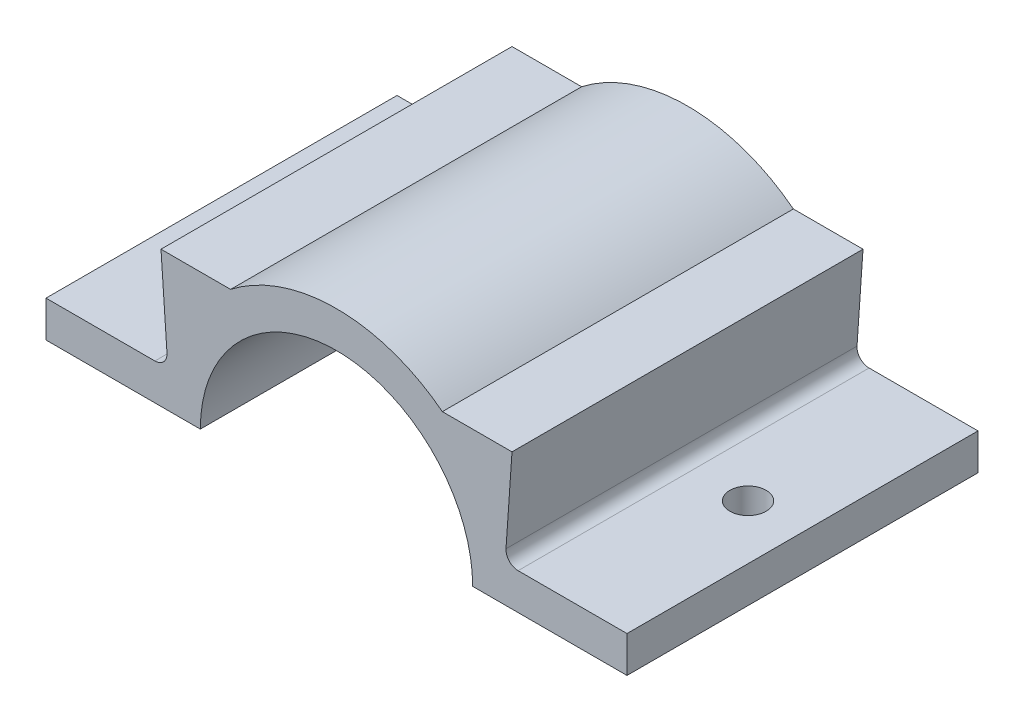
ISO-10303-21;
HEADER;
FILE_DESCRIPTION(('STEP AP214'),'2;1');
FILE_NAME('part.step','',(''),(''),'','','');
FILE_SCHEMA(('AUTOMOTIVE_DESIGN { 1 0 10303 214 1 1 1 1 }'));
ENDSEC;
DATA;
#1=APPLICATION_CONTEXT('core data for automotive mechanical design processes');
#2=APPLICATION_PROTOCOL_DEFINITION('international standard','automotive_design',2000,#1);
#3=PRODUCT_CONTEXT('',#1,'mechanical');
#4=PRODUCT('Part','Part','',(#3));
#5=PRODUCT_RELATED_PRODUCT_CATEGORY('part','',(#4));
#6=PRODUCT_DEFINITION_FORMATION('','',#4);
#7=PRODUCT_DEFINITION_CONTEXT('part definition',#1,'design');
#8=PRODUCT_DEFINITION('design','',#6,#7);
#9=PRODUCT_DEFINITION_SHAPE('','',#8);
#10=(LENGTH_UNIT() NAMED_UNIT(*) SI_UNIT(.MILLI.,.METRE.));
#11=(NAMED_UNIT(*) PLANE_ANGLE_UNIT() SI_UNIT($,.RADIAN.));
#12=(NAMED_UNIT(*) SI_UNIT($,.STERADIAN.) SOLID_ANGLE_UNIT());
#13=UNCERTAINTY_MEASURE_WITH_UNIT(LENGTH_MEASURE(1.E-05),#10,'distance_accuracy_value','');
#14=(GEOMETRIC_REPRESENTATION_CONTEXT(3) GLOBAL_UNCERTAINTY_ASSIGNED_CONTEXT((#13)) GLOBAL_UNIT_ASSIGNED_CONTEXT((#10,
#11,#12)) REPRESENTATION_CONTEXT('',''));
#15=CARTESIAN_POINT('',(0.,0.,0.));
#16=DIRECTION('',(0.,0.,1.));
#17=DIRECTION('',(1.,0.,0.));
#18=AXIS2_PLACEMENT_3D('',#15,#16,#17);
#19=CARTESIAN_POINT('',(0.,-7.125,-14.5));
#20=DIRECTION('',(0.,0.,1.));
#21=DIRECTION('',(1.,0.,0.));
#22=AXIS2_PLACEMENT_3D('',#19,#20,#21);
#23=CYLINDRICAL_SURFACE('',#22,11.25);
#24=DIRECTION('',(0.,0.,1.));
#25=VECTOR('',#24,1.);
#26=CARTESIAN_POINT('',(11.25,-7.125,-14.5));
#27=LINE('',#26,#25);
#28=CARTESIAN_POINT('',(11.25,-7.125,-14.5));
#29=VERTEX_POINT('',#28);
#30=CARTESIAN_POINT('',(11.25,-7.125,14.5));
#31=VERTEX_POINT('',#30);
#32=EDGE_CURVE('E130',#29,#31,#27,.T.);
#33=ORIENTED_EDGE('',*,*,#32,.T.);
#34=CARTESIAN_POINT('',(0.,-7.125,14.5));
#35=DIRECTION('',(0.,0.,-1.));
#36=DIRECTION('',(1.,0.,0.));
#37=AXIS2_PLACEMENT_3D('',#34,#35,#36);
#38=CIRCLE('',#37,11.25);
#39=CARTESIAN_POINT('',(-11.25,-7.125,14.5));
#40=VERTEX_POINT('',#39);
#41=EDGE_CURVE('E133',#40,#31,#38,.T.);
#42=ORIENTED_EDGE('',*,*,#41,.F.);
#43=DIRECTION('',(0.,0.,1.));
#44=VECTOR('',#43,1.);
#45=CARTESIAN_POINT('',(-11.25,-7.125,-14.5));
#46=LINE('',#45,#44);
#47=CARTESIAN_POINT('',(-11.25,-7.125,-14.5));
#48=VERTEX_POINT('',#47);
#49=EDGE_CURVE('E11',#48,#40,#46,.T.);
#50=ORIENTED_EDGE('',*,*,#49,.F.);
#51=CARTESIAN_POINT('',(0.,-7.125,-14.5));
#52=DIRECTION('',(0.,0.,-1.));
#53=DIRECTION('',(1.,0.,0.));
#54=AXIS2_PLACEMENT_3D('',#51,#52,#53);
#55=CIRCLE('',#54,11.25);
#56=EDGE_CURVE('E135',#48,#29,#55,.T.);
#57=ORIENTED_EDGE('',*,*,#56,.T.);
#58=EDGE_LOOP('',(#33,#42,#50,#57));
#59=FACE_BOUND('',#58,.T.);
#60=ADVANCED_FACE('F32',(#59),#23,.F.);
#61=CARTESIAN_POINT('',(-11.25,-7.125,-14.5));
#62=DIRECTION('',(0.,-1.,0.));
#63=DIRECTION('',(0.,0.,-1.));
#64=AXIS2_PLACEMENT_3D('',#61,#62,#63);
#65=PLANE('',#64);
#66=CARTESIAN_POINT('',(-19.5010123568079,-7.125,0.));
#67=DIRECTION('',(0.,-1.,0.));
#68=DIRECTION('',(0.,0.,-1.));
#69=AXIS2_PLACEMENT_3D('',#66,#67,#68);
#70=CIRCLE('',#69,1.5);
#71=CARTESIAN_POINT('',(-19.5010123568079,-7.125,1.5));
#72=VERTEX_POINT('',#71);
#73=EDGE_CURVE('E152',#72,#72,#70,.T.);
#74=ORIENTED_EDGE('',*,*,#73,.F.);
#75=EDGE_LOOP('',(#74));
#76=FACE_BOUND('',#75,.T.);
#77=ORIENTED_EDGE('',*,*,#49,.T.);
#78=DIRECTION('',(1.,0.,0.));
#79=VECTOR('',#78,1.);
#80=CARTESIAN_POINT('',(-24.,-7.125,14.5));
#81=LINE('',#80,#79);
#82=CARTESIAN_POINT('',(-24.,-7.125,14.5));
#83=VERTEX_POINT('',#82);
#84=EDGE_CURVE('E151',#83,#40,#81,.T.);
#85=ORIENTED_EDGE('',*,*,#84,.F.);
#86=DIRECTION('',(0.,0.,1.));
#87=VECTOR('',#86,1.);
#88=CARTESIAN_POINT('',(-24.,-7.125,-14.5));
#89=LINE('',#88,#87);
#90=CARTESIAN_POINT('',(-24.,-7.125,-14.5));
#91=VERTEX_POINT('',#90);
#92=EDGE_CURVE('E40',#91,#83,#89,.T.);
#93=ORIENTED_EDGE('',*,*,#92,.F.);
#94=DIRECTION('',(1.,0.,0.));
#95=VECTOR('',#94,1.);
#96=CARTESIAN_POINT('',(-24.,-7.125,-14.5));
#97=LINE('',#96,#95);
#98=EDGE_CURVE('E47',#91,#48,#97,.T.);
#99=ORIENTED_EDGE('',*,*,#98,.T.);
#100=EDGE_LOOP('',(#77,#85,#93,#99));
#101=FACE_BOUND('',#100,.T.);
#102=ADVANCED_FACE('F293',(#76,#101),#65,.T.);
#103=CARTESIAN_POINT('',(-24.,-7.125,-14.5));
#104=DIRECTION('',(-1.,0.,0.));
#105=DIRECTION('',(0.,0.,1.));
#106=AXIS2_PLACEMENT_3D('',#103,#104,#105);
#107=PLANE('',#106);
#108=ORIENTED_EDGE('',*,*,#92,.T.);
#109=DIRECTION('',(0.,-1.,0.));
#110=VECTOR('',#109,1.);
#111=CARTESIAN_POINT('',(-24.,-7.125,14.5));
#112=LINE('',#111,#110);
#113=CARTESIAN_POINT('',(-24.,-4.125,14.5));
#114=VERTEX_POINT('',#113);
#115=EDGE_CURVE('E187',#114,#83,#112,.T.);
#116=ORIENTED_EDGE('',*,*,#115,.F.);
#117=DIRECTION('',(0.,0.,1.));
#118=VECTOR('',#117,1.);
#119=CARTESIAN_POINT('',(-24.,-4.125,-14.5));
#120=LINE('',#119,#118);
#121=CARTESIAN_POINT('',(-24.,-4.125,-14.5));
#122=VERTEX_POINT('',#121);
#123=EDGE_CURVE('E226',#122,#114,#120,.T.);
#124=ORIENTED_EDGE('',*,*,#123,.F.);
#125=DIRECTION('',(0.,-1.,0.));
#126=VECTOR('',#125,1.);
#127=CARTESIAN_POINT('',(-24.,-7.125,-14.5));
#128=LINE('',#127,#126);
#129=EDGE_CURVE('E221',#122,#91,#128,.T.);
#130=ORIENTED_EDGE('',*,*,#129,.T.);
#131=EDGE_LOOP('',(#108,#116,#124,#130));
#132=FACE_BOUND('',#131,.T.);
#133=ADVANCED_FACE('F292',(#132),#107,.T.);
#134=CARTESIAN_POINT('',(-24.,-4.125,-14.5));
#135=DIRECTION('',(0.,1.,0.));
#136=DIRECTION('',(0.,0.,1.));
#137=AXIS2_PLACEMENT_3D('',#134,#135,#136);
#138=PLANE('',#137);
#139=CARTESIAN_POINT('',(-19.5010123568079,-4.125,0.));
#140=DIRECTION('',(0.,1.,0.));
#141=DIRECTION('',(0.,0.,1.));
#142=AXIS2_PLACEMENT_3D('',#139,#140,#141);
#143=CIRCLE('',#142,1.5);
#144=CARTESIAN_POINT('',(-19.5010123568079,-4.125,1.5));
#145=VERTEX_POINT('',#144);
#146=EDGE_CURVE('E155',#145,#145,#143,.T.);
#147=ORIENTED_EDGE('',*,*,#146,.F.);
#148=EDGE_LOOP('',(#147));
#149=FACE_BOUND('',#148,.T.);
#150=ORIENTED_EDGE('',*,*,#123,.T.);
#151=DIRECTION('',(-1.,0.,0.));
#152=VECTOR('',#151,1.);
#153=CARTESIAN_POINT('',(-15.0020247136159,-4.125,14.5));
#154=LINE('',#153,#152);
#155=CARTESIAN_POINT('',(-15.0020247136159,-4.125,14.5));
#156=VERTEX_POINT('',#155);
#157=EDGE_CURVE('E184',#156,#114,#154,.T.);
#158=ORIENTED_EDGE('',*,*,#157,.F.);
#159=DIRECTION('',(0.,0.,1.));
#160=VECTOR('',#159,1.);
#161=CARTESIAN_POINT('',(-15.0020247136159,-4.125,-14.5));
#162=LINE('',#161,#160);
#163=CARTESIAN_POINT('',(-15.0020247136159,-4.125,-14.5));
#164=VERTEX_POINT('',#163);
#165=EDGE_CURVE('E228',#164,#156,#162,.T.);
#166=ORIENTED_EDGE('',*,*,#165,.F.);
#167=DIRECTION('',(-1.,0.,0.));
#168=VECTOR('',#167,1.);
#169=CARTESIAN_POINT('',(-15.0020247136159,-4.125,-14.5));
#170=LINE('',#169,#168);
#171=EDGE_CURVE('E219',#164,#122,#170,.T.);
#172=ORIENTED_EDGE('',*,*,#171,.T.);
#173=EDGE_LOOP('',(#150,#158,#166,#172));
#174=FACE_BOUND('',#173,.T.);
#175=ADVANCED_FACE('F288',(#149,#174),#138,.T.);
#176=CARTESIAN_POINT('',(-15.0020247136159,-3.125,-14.5));
#177=DIRECTION('',(0.,0.,1.));
#178=DIRECTION('',(1.,0.,0.));
#179=AXIS2_PLACEMENT_3D('',#176,#177,#178);
#180=CYLINDRICAL_SURFACE('',#179,1.);
#181=ORIENTED_EDGE('',*,*,#165,.T.);
#182=CARTESIAN_POINT('',(-15.0020247136159,-3.125,14.5));
#183=DIRECTION('',(0.,0.,-1.));
#184=DIRECTION('',(-1.,0.,0.));
#185=AXIS2_PLACEMENT_3D('',#182,#183,#184);
#186=CIRCLE('',#185,1.);
#187=CARTESIAN_POINT('',(-14.0043977293939,-3.05614943462751,14.5));
#188=VERTEX_POINT('',#187);
#189=EDGE_CURVE('E181',#188,#156,#186,.T.);
#190=ORIENTED_EDGE('',*,*,#189,.F.);
#191=DIRECTION('',(0.,0.,1.));
#192=VECTOR('',#191,1.);
#193=CARTESIAN_POINT('',(-14.0043977293939,-3.05614943462751,-14.5));
#194=LINE('',#193,#192);
#195=CARTESIAN_POINT('',(-14.0043977293939,-3.05614943462751,-14.5));
#196=VERTEX_POINT('',#195);
#197=EDGE_CURVE('E230',#196,#188,#194,.T.);
#198=ORIENTED_EDGE('',*,*,#197,.F.);
#199=CARTESIAN_POINT('',(-15.0020247136159,-3.125,-14.5));
#200=DIRECTION('',(0.,0.,-1.));
#201=DIRECTION('',(-1.,0.,0.));
#202=AXIS2_PLACEMENT_3D('',#199,#200,#201);
#203=CIRCLE('',#202,1.);
#204=EDGE_CURVE('E216',#196,#164,#203,.T.);
#205=ORIENTED_EDGE('',*,*,#204,.T.);
#206=EDGE_LOOP('',(#181,#190,#198,#205));
#207=FACE_BOUND('',#206,.T.);
#208=ADVANCED_FACE('F283',(#207),#180,.F.);
#209=CARTESIAN_POINT('',(-14.0043977293939,-3.05614943462751,-14.5));
#210=DIRECTION('',(-0.997626984222004,-0.0688505653724818,0.));
#211=DIRECTION('',(0.0688505653724818,-0.997626984222004,0.));
#212=AXIS2_PLACEMENT_3D('',#209,#210,#211);
#213=PLANE('',#212);
#214=ORIENTED_EDGE('',*,*,#197,.T.);
#215=DIRECTION('',(0.0688505653724818,-0.997626984222003,0.));
#216=VECTOR('',#215,1.);
#217=CARTESIAN_POINT('',(-14.0043977293939,-3.05614943462751,14.5));
#218=LINE('',#217,#216);
#219=CARTESIAN_POINT('',(-14.5,4.125,14.5));
#220=VERTEX_POINT('',#219);
#221=EDGE_CURVE('E178',#220,#188,#218,.T.);
#222=ORIENTED_EDGE('',*,*,#221,.F.);
#223=DIRECTION('',(0.,0.,1.));
#224=VECTOR('',#223,1.);
#225=CARTESIAN_POINT('',(-14.5,4.125,-14.5));
#226=LINE('',#225,#224);
#227=CARTESIAN_POINT('',(-14.5,4.125,-14.5));
#228=VERTEX_POINT('',#227);
#229=EDGE_CURVE('E232',#228,#220,#226,.T.);
#230=ORIENTED_EDGE('',*,*,#229,.F.);
#231=DIRECTION('',(0.0688505653724818,-0.997626984222003,0.));
#232=VECTOR('',#231,1.);
#233=CARTESIAN_POINT('',(-14.0043977293939,-3.05614943462751,-14.5));
#234=LINE('',#233,#232);
#235=EDGE_CURVE('E213',#228,#196,#234,.T.);
#236=ORIENTED_EDGE('',*,*,#235,.T.);
#237=EDGE_LOOP('',(#214,#222,#230,#236));
#238=FACE_BOUND('',#237,.T.);
#239=ADVANCED_FACE('F281',(#238),#213,.T.);
#240=CARTESIAN_POINT('',(-14.5,4.125,-14.5));
#241=DIRECTION('',(0.,1.,0.));
#242=DIRECTION('',(0.,0.,1.));
#243=AXIS2_PLACEMENT_3D('',#240,#241,#242);
#244=PLANE('',#243);
#245=ORIENTED_EDGE('',*,*,#229,.T.);
#246=DIRECTION('',(-1.,0.,0.));
#247=VECTOR('',#246,1.);
#248=CARTESIAN_POINT('',(-14.5,4.125,14.5));
#249=LINE('',#248,#247);
#250=CARTESIAN_POINT('',(-8.74642784226795,4.125,14.5));
#251=VERTEX_POINT('',#250);
#252=EDGE_CURVE('E175',#251,#220,#249,.T.);
#253=ORIENTED_EDGE('',*,*,#252,.F.);
#254=DIRECTION('',(0.,0.,1.));
#255=VECTOR('',#254,1.);
#256=CARTESIAN_POINT('',(-8.74642784226795,4.125,-14.5));
#257=LINE('',#256,#255);
#258=CARTESIAN_POINT('',(-8.74642784226795,4.125,-14.5));
#259=VERTEX_POINT('',#258);
#260=EDGE_CURVE('E234',#259,#251,#257,.T.);
#261=ORIENTED_EDGE('',*,*,#260,.F.);
#262=DIRECTION('',(-1.,0.,0.));
#263=VECTOR('',#262,1.);
#264=CARTESIAN_POINT('',(-14.5,4.125,-14.5));
#265=LINE('',#264,#263);
#266=EDGE_CURVE('E210',#259,#228,#265,.T.);
#267=ORIENTED_EDGE('',*,*,#266,.T.);
#268=EDGE_LOOP('',(#245,#253,#261,#267));
#269=FACE_BOUND('',#268,.T.);
#270=ADVANCED_FACE('F276',(#269),#244,.T.);
#271=CARTESIAN_POINT('',(0.,-7.125,-14.5));
#272=DIRECTION('',(0.,0.,1.));
#273=DIRECTION('',(1.,0.,0.));
#274=AXIS2_PLACEMENT_3D('',#271,#272,#273);
#275=CYLINDRICAL_SURFACE('',#274,14.25);
#276=ORIENTED_EDGE('',*,*,#260,.T.);
#277=CARTESIAN_POINT('',(0.,-7.125,14.5));
#278=DIRECTION('',(0.,0.,1.));
#279=DIRECTION('',(1.,0.,0.));
#280=AXIS2_PLACEMENT_3D('',#277,#278,#279);
#281=CIRCLE('',#280,14.25);
#282=CARTESIAN_POINT('',(8.74642784226795,4.125,14.5));
#283=VERTEX_POINT('',#282);
#284=EDGE_CURVE('E172',#283,#251,#281,.T.);
#285=ORIENTED_EDGE('',*,*,#284,.F.);
#286=DIRECTION('',(0.,0.,1.));
#287=VECTOR('',#286,1.);
#288=CARTESIAN_POINT('',(8.74642784226795,4.125,-14.5));
#289=LINE('',#288,#287);
#290=CARTESIAN_POINT('',(8.74642784226795,4.125,-14.5));
#291=VERTEX_POINT('',#290);
#292=EDGE_CURVE('E236',#291,#283,#289,.T.);
#293=ORIENTED_EDGE('',*,*,#292,.F.);
#294=CARTESIAN_POINT('',(0.,-7.125,-14.5));
#295=DIRECTION('',(0.,0.,1.));
#296=DIRECTION('',(1.,0.,0.));
#297=AXIS2_PLACEMENT_3D('',#294,#295,#296);
#298=CIRCLE('',#297,14.25);
#299=EDGE_CURVE('E207',#291,#259,#298,.T.);
#300=ORIENTED_EDGE('',*,*,#299,.T.);
#301=EDGE_LOOP('',(#276,#285,#293,#300));
#302=FACE_BOUND('',#301,.T.);
#303=ADVANCED_FACE('F271',(#302),#275,.T.);
#304=CARTESIAN_POINT('',(8.74642784226795,4.125,-14.5));
#305=DIRECTION('',(0.,1.,0.));
#306=DIRECTION('',(0.,0.,1.));
#307=AXIS2_PLACEMENT_3D('',#304,#305,#306);
#308=PLANE('',#307);
#309=ORIENTED_EDGE('',*,*,#292,.T.);
#310=DIRECTION('',(-1.,0.,0.));
#311=VECTOR('',#310,1.);
#312=CARTESIAN_POINT('',(8.74642784226795,4.125,14.5));
#313=LINE('',#312,#311);
#314=CARTESIAN_POINT('',(14.5,4.125,14.5));
#315=VERTEX_POINT('',#314);
#316=EDGE_CURVE('E169',#315,#283,#313,.T.);
#317=ORIENTED_EDGE('',*,*,#316,.F.);
#318=DIRECTION('',(0.,0.,1.));
#319=VECTOR('',#318,1.);
#320=CARTESIAN_POINT('',(14.5,4.125,-14.5));
#321=LINE('',#320,#319);
#322=CARTESIAN_POINT('',(14.5,4.125,-14.5));
#323=VERTEX_POINT('',#322);
#324=EDGE_CURVE('E238',#323,#315,#321,.T.);
#325=ORIENTED_EDGE('',*,*,#324,.F.);
#326=DIRECTION('',(-1.,0.,0.));
#327=VECTOR('',#326,1.);
#328=CARTESIAN_POINT('',(8.74642784226795,4.125,-14.5));
#329=LINE('',#328,#327);
#330=EDGE_CURVE('E204',#323,#291,#329,.T.);
#331=ORIENTED_EDGE('',*,*,#330,.T.);
#332=EDGE_LOOP('',(#309,#317,#325,#331));
#333=FACE_BOUND('',#332,.T.);
#334=ADVANCED_FACE('F269',(#333),#308,.T.);
#335=CARTESIAN_POINT('',(14.5,4.125,-14.5));
#336=DIRECTION('',(0.997626984222004,-0.0688505653724818,0.));
#337=DIRECTION('',(0.0688505653724818,0.997626984222004,0.));
#338=AXIS2_PLACEMENT_3D('',#335,#336,#337);
#339=PLANE('',#338);
#340=ORIENTED_EDGE('',*,*,#324,.T.);
#341=DIRECTION('',(0.0688505653724818,0.997626984222003,0.));
#342=VECTOR('',#341,1.);
#343=CARTESIAN_POINT('',(14.5,4.125,14.5));
#344=LINE('',#343,#342);
#345=CARTESIAN_POINT('',(14.0043977293939,-3.05614943462751,14.5));
#346=VERTEX_POINT('',#345);
#347=EDGE_CURVE('E166',#346,#315,#344,.T.);
#348=ORIENTED_EDGE('',*,*,#347,.F.);
#349=DIRECTION('',(0.,0.,1.));
#350=VECTOR('',#349,1.);
#351=CARTESIAN_POINT('',(14.0043977293939,-3.05614943462751,-14.5));
#352=LINE('',#351,#350);
#353=CARTESIAN_POINT('',(14.0043977293939,-3.05614943462751,-14.5));
#354=VERTEX_POINT('',#353);
#355=EDGE_CURVE('E240',#354,#346,#352,.T.);
#356=ORIENTED_EDGE('',*,*,#355,.F.);
#357=DIRECTION('',(0.0688505653724818,0.997626984222003,0.));
#358=VECTOR('',#357,1.);
#359=CARTESIAN_POINT('',(14.5,4.125,-14.5));
#360=LINE('',#359,#358);
#361=EDGE_CURVE('E201',#354,#323,#360,.T.);
#362=ORIENTED_EDGE('',*,*,#361,.T.);
#363=EDGE_LOOP('',(#340,#348,#356,#362));
#364=FACE_BOUND('',#363,.T.);
#365=ADVANCED_FACE('F264',(#364),#339,.T.);
#366=CARTESIAN_POINT('',(15.0020247136159,-3.125,-14.5));
#367=DIRECTION('',(0.,0.,1.));
#368=DIRECTION('',(1.,0.,0.));
#369=AXIS2_PLACEMENT_3D('',#366,#367,#368);
#370=CYLINDRICAL_SURFACE('',#369,1.);
#371=ORIENTED_EDGE('',*,*,#355,.T.);
#372=CARTESIAN_POINT('',(15.0020247136159,-3.125,14.5));
#373=DIRECTION('',(0.,0.,-1.));
#374=DIRECTION('',(-1.,0.,0.));
#375=AXIS2_PLACEMENT_3D('',#372,#373,#374);
#376=CIRCLE('',#375,1.);
#377=CARTESIAN_POINT('',(15.0020247136159,-4.125,14.5));
#378=VERTEX_POINT('',#377);
#379=EDGE_CURVE('E163',#378,#346,#376,.T.);
#380=ORIENTED_EDGE('',*,*,#379,.F.);
#381=DIRECTION('',(0.,0.,1.));
#382=VECTOR('',#381,1.);
#383=CARTESIAN_POINT('',(15.0020247136159,-4.125,-14.5));
#384=LINE('',#383,#382);
#385=CARTESIAN_POINT('',(15.0020247136159,-4.125,-14.5));
#386=VERTEX_POINT('',#385);
#387=EDGE_CURVE('E242',#386,#378,#384,.T.);
#388=ORIENTED_EDGE('',*,*,#387,.F.);
#389=CARTESIAN_POINT('',(15.0020247136159,-3.125,-14.5));
#390=DIRECTION('',(0.,0.,-1.));
#391=DIRECTION('',(-1.,0.,0.));
#392=AXIS2_PLACEMENT_3D('',#389,#390,#391);
#393=CIRCLE('',#392,1.);
#394=EDGE_CURVE('E198',#386,#354,#393,.T.);
#395=ORIENTED_EDGE('',*,*,#394,.T.);
#396=EDGE_LOOP('',(#371,#380,#388,#395));
#397=FACE_BOUND('',#396,.T.);
#398=ADVANCED_FACE('F257',(#397),#370,.F.);
#399=CARTESIAN_POINT('',(15.0020247136159,-4.125,-14.5));
#400=DIRECTION('',(0.,1.,0.));
#401=DIRECTION('',(0.,0.,1.));
#402=AXIS2_PLACEMENT_3D('',#399,#400,#401);
#403=PLANE('',#402);
#404=CARTESIAN_POINT('',(19.5010123568079,-4.125,0.));
#405=DIRECTION('',(0.,1.,0.));
#406=DIRECTION('',(0.,0.,1.));
#407=AXIS2_PLACEMENT_3D('',#404,#405,#406);
#408=CIRCLE('',#407,1.5);
#409=CARTESIAN_POINT('',(19.5010123568079,-4.125,1.5));
#410=VERTEX_POINT('',#409);
#411=EDGE_CURVE('E335',#410,#410,#408,.T.);
#412=ORIENTED_EDGE('',*,*,#411,.F.);
#413=EDGE_LOOP('',(#412));
#414=FACE_BOUND('',#413,.T.);
#415=ORIENTED_EDGE('',*,*,#387,.T.);
#416=DIRECTION('',(-1.,0.,0.));
#417=VECTOR('',#416,1.);
#418=CARTESIAN_POINT('',(24.,-4.125,14.5));
#419=LINE('',#418,#417);
#420=CARTESIAN_POINT('',(24.,-4.125,14.5));
#421=VERTEX_POINT('',#420);
#422=EDGE_CURVE('E160',#421,#378,#419,.T.);
#423=ORIENTED_EDGE('',*,*,#422,.F.);
#424=DIRECTION('',(0.,0.,1.));
#425=VECTOR('',#424,1.);
#426=CARTESIAN_POINT('',(24.,-4.125,-14.5));
#427=LINE('',#426,#425);
#428=CARTESIAN_POINT('',(24.,-4.125,-14.5));
#429=VERTEX_POINT('',#428);
#430=EDGE_CURVE('E244',#429,#421,#427,.T.);
#431=ORIENTED_EDGE('',*,*,#430,.F.);
#432=DIRECTION('',(-1.,0.,0.));
#433=VECTOR('',#432,1.);
#434=CARTESIAN_POINT('',(24.,-4.125,-14.5));
#435=LINE('',#434,#433);
#436=EDGE_CURVE('E196',#429,#386,#435,.T.);
#437=ORIENTED_EDGE('',*,*,#436,.T.);
#438=EDGE_LOOP('',(#415,#423,#431,#437));
#439=FACE_BOUND('',#438,.T.);
#440=ADVANCED_FACE('F253',(#414,#439),#403,.T.);
#441=CARTESIAN_POINT('',(24.,-7.125,-14.5));
#442=DIRECTION('',(1.,0.,0.));
#443=DIRECTION('',(0.,0.,-1.));
#444=AXIS2_PLACEMENT_3D('',#441,#442,#443);
#445=PLANE('',#444);
#446=ORIENTED_EDGE('',*,*,#430,.T.);
#447=DIRECTION('',(0.,1.,0.));
#448=VECTOR('',#447,1.);
#449=CARTESIAN_POINT('',(24.,-7.125,14.5));
#450=LINE('',#449,#448);
#451=CARTESIAN_POINT('',(24.,-7.125,14.5));
#452=VERTEX_POINT('',#451);
#453=EDGE_CURVE('E146',#452,#421,#450,.T.);
#454=ORIENTED_EDGE('',*,*,#453,.F.);
#455=DIRECTION('',(0.,0.,1.));
#456=VECTOR('',#455,1.);
#457=CARTESIAN_POINT('',(24.,-7.125,-14.5));
#458=LINE('',#457,#456);
#459=CARTESIAN_POINT('',(24.,-7.125,-14.5));
#460=VERTEX_POINT('',#459);
#461=EDGE_CURVE('E138',#460,#452,#458,.T.);
#462=ORIENTED_EDGE('',*,*,#461,.F.);
#463=DIRECTION('',(0.,1.,0.));
#464=VECTOR('',#463,1.);
#465=CARTESIAN_POINT('',(24.,-7.125,-14.5));
#466=LINE('',#465,#464);
#467=EDGE_CURVE('E193',#460,#429,#466,.T.);
#468=ORIENTED_EDGE('',*,*,#467,.T.);
#469=EDGE_LOOP('',(#446,#454,#462,#468));
#470=FACE_BOUND('',#469,.T.);
#471=ADVANCED_FACE('F247',(#470),#445,.T.);
#472=CARTESIAN_POINT('',(24.,-7.125,-14.5));
#473=DIRECTION('',(0.,-1.,0.));
#474=DIRECTION('',(1.,0.,0.));
#475=AXIS2_PLACEMENT_3D('',#472,#473,#474);
#476=PLANE('',#475);
#477=CARTESIAN_POINT('',(19.5010123568079,-7.125,0.));
#478=DIRECTION('',(0.,-1.,0.));
#479=DIRECTION('',(1.,0.,0.));
#480=AXIS2_PLACEMENT_3D('',#477,#478,#479);
#481=CIRCLE('',#480,1.5);
#482=CARTESIAN_POINT('',(19.5010123568079,-7.125,1.5));
#483=VERTEX_POINT('',#482);
#484=EDGE_CURVE('E35',#483,#483,#481,.T.);
#485=ORIENTED_EDGE('',*,*,#484,.F.);
#486=EDGE_LOOP('',(#485));
#487=FACE_BOUND('',#486,.T.);
#488=ORIENTED_EDGE('',*,*,#461,.T.);
#489=DIRECTION('',(1.,0.,0.));
#490=VECTOR('',#489,1.);
#491=CARTESIAN_POINT('',(11.25,-7.125,14.5));
#492=LINE('',#491,#490);
#493=EDGE_CURVE('E140',#31,#452,#492,.T.);
#494=ORIENTED_EDGE('',*,*,#493,.F.);
#495=ORIENTED_EDGE('',*,*,#32,.F.);
#496=DIRECTION('',(1.,0.,0.));
#497=VECTOR('',#496,1.);
#498=CARTESIAN_POINT('',(11.25,-7.125,-14.5));
#499=LINE('',#498,#497);
#500=EDGE_CURVE('E191',#29,#460,#499,.T.);
#501=ORIENTED_EDGE('',*,*,#500,.T.);
#502=EDGE_LOOP('',(#488,#494,#495,#501));
#503=FACE_BOUND('',#502,.T.);
#504=ADVANCED_FACE('F141',(#487,#503),#476,.T.);
#505=CARTESIAN_POINT('',(0.,-7.125,-14.5));
#506=DIRECTION('',(0.,0.,1.));
#507=DIRECTION('',(1.,0.,0.));
#508=AXIS2_PLACEMENT_3D('',#505,#506,#507);
#509=PLANE('',#508);
#510=ORIENTED_EDGE('',*,*,#56,.F.);
#511=ORIENTED_EDGE('',*,*,#98,.F.);
#512=ORIENTED_EDGE('',*,*,#129,.F.);
#513=ORIENTED_EDGE('',*,*,#171,.F.);
#514=ORIENTED_EDGE('',*,*,#204,.F.);
#515=ORIENTED_EDGE('',*,*,#235,.F.);
#516=ORIENTED_EDGE('',*,*,#266,.F.);
#517=ORIENTED_EDGE('',*,*,#299,.F.);
#518=ORIENTED_EDGE('',*,*,#330,.F.);
#519=ORIENTED_EDGE('',*,*,#361,.F.);
#520=ORIENTED_EDGE('',*,*,#394,.F.);
#521=ORIENTED_EDGE('',*,*,#436,.F.);
#522=ORIENTED_EDGE('',*,*,#467,.F.);
#523=ORIENTED_EDGE('',*,*,#500,.F.);
#524=EDGE_LOOP('',(#510,#511,#512,#513,#514,#515,#516,#517,#518,#519,#520,#521,#522,#523));
#525=FACE_BOUND('',#524,.T.);
#526=ADVANCED_FACE('F260',(#525),#509,.F.);
#527=CARTESIAN_POINT('',(0.,-7.125,14.5));
#528=DIRECTION('',(0.,0.,1.));
#529=DIRECTION('',(1.,0.,0.));
#530=AXIS2_PLACEMENT_3D('',#527,#528,#529);
#531=PLANE('',#530);
#532=ORIENTED_EDGE('',*,*,#41,.T.);
#533=ORIENTED_EDGE('',*,*,#493,.T.);
#534=ORIENTED_EDGE('',*,*,#453,.T.);
#535=ORIENTED_EDGE('',*,*,#422,.T.);
#536=ORIENTED_EDGE('',*,*,#379,.T.);
#537=ORIENTED_EDGE('',*,*,#347,.T.);
#538=ORIENTED_EDGE('',*,*,#316,.T.);
#539=ORIENTED_EDGE('',*,*,#284,.T.);
#540=ORIENTED_EDGE('',*,*,#252,.T.);
#541=ORIENTED_EDGE('',*,*,#221,.T.);
#542=ORIENTED_EDGE('',*,*,#189,.T.);
#543=ORIENTED_EDGE('',*,*,#157,.T.);
#544=ORIENTED_EDGE('',*,*,#115,.T.);
#545=ORIENTED_EDGE('',*,*,#84,.T.);
#546=EDGE_LOOP('',(#532,#533,#534,#535,#536,#537,#538,#539,#540,#541,#542,#543,#544,#545));
#547=FACE_BOUND('',#546,.T.);
#548=ADVANCED_FACE('F149',(#547),#531,.T.);
#549=CARTESIAN_POINT('',(-19.5010123568079,-18.625,0.));
#550=DIRECTION('',(0.,1.,0.));
#551=DIRECTION('',(0.,0.,1.));
#552=AXIS2_PLACEMENT_3D('',#549,#550,#551);
#553=CYLINDRICAL_SURFACE('',#552,1.5);
#554=CARTESIAN_POINT('',(-19.5010123568079,-7.125,1.5));
#555=CARTESIAN_POINT('',(-19.5010123568079,-7.09375,1.5));
#556=CARTESIAN_POINT('',(-19.5010123568079,-7.0625,1.5));
#557=CARTESIAN_POINT('',(-19.5010123568079,-7.,1.5));
#558=CARTESIAN_POINT('',(-19.5010123568079,-6.96875,1.5));
#559=CARTESIAN_POINT('',(-19.5010123568079,-6.90625,1.5));
#560=CARTESIAN_POINT('',(-19.5010123568079,-6.875,1.5));
#561=CARTESIAN_POINT('',(-19.5010123568079,-6.8125,1.5));
#562=CARTESIAN_POINT('',(-19.5010123568079,-6.78125,1.5));
#563=CARTESIAN_POINT('',(-19.5010123568079,-6.71875,1.5));
#564=CARTESIAN_POINT('',(-19.5010123568079,-6.6875,1.5));
#565=CARTESIAN_POINT('',(-19.5010123568079,-6.625,1.5));
#566=CARTESIAN_POINT('',(-19.5010123568079,-6.59375,1.5));
#567=CARTESIAN_POINT('',(-19.5010123568079,-6.53125,1.5));
#568=CARTESIAN_POINT('',(-19.5010123568079,-6.5,1.5));
#569=CARTESIAN_POINT('',(-19.5010123568079,-6.4375,1.5));
#570=CARTESIAN_POINT('',(-19.5010123568079,-6.40625,1.5));
#571=CARTESIAN_POINT('',(-19.5010123568079,-6.34375,1.5));
#572=CARTESIAN_POINT('',(-19.5010123568079,-6.3125,1.5));
#573=CARTESIAN_POINT('',(-19.5010123568079,-6.25,1.5));
#574=CARTESIAN_POINT('',(-19.5010123568079,-6.21875,1.5));
#575=CARTESIAN_POINT('',(-19.5010123568079,-6.15625,1.5));
#576=CARTESIAN_POINT('',(-19.5010123568079,-6.125,1.5));
#577=CARTESIAN_POINT('',(-19.5010123568079,-6.0625,1.5));
#578=CARTESIAN_POINT('',(-19.5010123568079,-6.03125,1.5));
#579=CARTESIAN_POINT('',(-19.5010123568079,-5.96875,1.5));
#580=CARTESIAN_POINT('',(-19.5010123568079,-5.9375,1.5));
#581=CARTESIAN_POINT('',(-19.5010123568079,-5.875,1.5));
#582=CARTESIAN_POINT('',(-19.5010123568079,-5.84375,1.5));
#583=CARTESIAN_POINT('',(-19.5010123568079,-5.78125,1.5));
#584=CARTESIAN_POINT('',(-19.5010123568079,-5.75,1.5));
#585=CARTESIAN_POINT('',(-19.5010123568079,-5.6875,1.5));
#586=CARTESIAN_POINT('',(-19.5010123568079,-5.65625,1.5));
#587=CARTESIAN_POINT('',(-19.5010123568079,-5.59375,1.5));
#588=CARTESIAN_POINT('',(-19.5010123568079,-5.5625,1.5));
#589=CARTESIAN_POINT('',(-19.5010123568079,-5.5,1.5));
#590=CARTESIAN_POINT('',(-19.5010123568079,-5.46875,1.5));
#591=CARTESIAN_POINT('',(-19.5010123568079,-5.40625,1.5));
#592=CARTESIAN_POINT('',(-19.5010123568079,-5.375,1.5));
#593=CARTESIAN_POINT('',(-19.5010123568079,-5.3125,1.5));
#594=CARTESIAN_POINT('',(-19.5010123568079,-5.28125,1.5));
#595=CARTESIAN_POINT('',(-19.5010123568079,-5.21875,1.5));
#596=CARTESIAN_POINT('',(-19.5010123568079,-5.1875,1.5));
#597=CARTESIAN_POINT('',(-19.5010123568079,-5.125,1.5));
#598=CARTESIAN_POINT('',(-19.5010123568079,-5.09375,1.5));
#599=CARTESIAN_POINT('',(-19.5010123568079,-5.03125,1.5));
#600=CARTESIAN_POINT('',(-19.5010123568079,-5.,1.5));
#601=CARTESIAN_POINT('',(-19.5010123568079,-4.9375,1.5));
#602=CARTESIAN_POINT('',(-19.5010123568079,-4.90625,1.5));
#603=CARTESIAN_POINT('',(-19.5010123568079,-4.84375,1.5));
#604=CARTESIAN_POINT('',(-19.5010123568079,-4.8125,1.5));
#605=CARTESIAN_POINT('',(-19.5010123568079,-4.75,1.5));
#606=CARTESIAN_POINT('',(-19.5010123568079,-4.71875,1.5));
#607=CARTESIAN_POINT('',(-19.5010123568079,-4.65625,1.5));
#608=CARTESIAN_POINT('',(-19.5010123568079,-4.625,1.5));
#609=CARTESIAN_POINT('',(-19.5010123568079,-4.5625,1.5));
#610=CARTESIAN_POINT('',(-19.5010123568079,-4.53125,1.5));
#611=CARTESIAN_POINT('',(-19.5010123568079,-4.46875,1.5));
#612=CARTESIAN_POINT('',(-19.5010123568079,-4.4375,1.5));
#613=CARTESIAN_POINT('',(-19.5010123568079,-4.375,1.5));
#614=CARTESIAN_POINT('',(-19.5010123568079,-4.34375,1.5));
#615=CARTESIAN_POINT('',(-19.5010123568079,-4.28125,1.5));
#616=CARTESIAN_POINT('',(-19.5010123568079,-4.25,1.5));
#617=CARTESIAN_POINT('',(-19.5010123568079,-4.1875,1.5));
#618=CARTESIAN_POINT('',(-19.5010123568079,-4.15625,1.5));
#619=CARTESIAN_POINT('',(-19.5010123568079,-4.125,1.5));
#620=B_SPLINE_CURVE_WITH_KNOTS('',3,(#554,#555,#556,#557,#558,#559,#560,#561,#562,#563,#564,
#565,#566,#567,#568,#569,#570,#571,#572,#573,#574,#575,#576,#577,#578,#579,#580,#581,#582,#583,
#584,#585,#586,#587,#588,#589,#590,#591,#592,#593,#594,#595,#596,#597,#598,#599,#600,#601,#602,
#603,#604,#605,#606,#607,#608,#609,#610,#611,#612,#613,#614,#615,#616,#617,#618,#619),
.UNSPECIFIED.,.F.,.F.,(4,2,2,2,2,2,2,2,2,2,2,2,2,2,2,2,2,2,2,2,2,2,2,2,2,2,2,2,2,2,2,2,4),(0.,
0.0937500000000001,0.1875,0.28125,0.375,0.46875,0.5625,0.656250000000001,0.750000000000001,
0.843750000000001,0.937500000000001,1.03125,1.125,1.21875,1.3125,1.40625,1.5,1.59375,1.6875,
1.78125,1.875,1.96875,2.0625,2.15625,2.25,2.34375,2.4375,2.53125,2.625,2.71875,2.8125,2.90625,
3.),.UNSPECIFIED.);
#621=EDGE_CURVE('BSEAM343',#72,#145,#620,.T.);
#622=ORIENTED_EDGE('',*,*,#73,.T.);
#623=ORIENTED_EDGE('',*,*,#146,.T.);
#624=ORIENTED_EDGE('',*,*,#621,.T.);
#625=ORIENTED_EDGE('',*,*,#621,.F.);
#626=EDGE_LOOP('',(#622,#624,#623,#625));
#627=FACE_BOUND('',#626,.T.);
#628=ADVANCED_FACE('F343',(#627),#553,.F.);
#629=CARTESIAN_POINT('',(19.5010123568079,-18.625,0.));
#630=DIRECTION('',(0.,1.,0.));
#631=DIRECTION('',(0.,0.,1.));
#632=AXIS2_PLACEMENT_3D('',#629,#630,#631);
#633=CYLINDRICAL_SURFACE('',#632,1.5);
#634=CARTESIAN_POINT('',(19.5010123568079,-7.125,1.5));
#635=CARTESIAN_POINT('',(19.5010123568079,-7.09375,1.5));
#636=CARTESIAN_POINT('',(19.5010123568079,-7.0625,1.5));
#637=CARTESIAN_POINT('',(19.5010123568079,-7.,1.5));
#638=CARTESIAN_POINT('',(19.5010123568079,-6.96875,1.5));
#639=CARTESIAN_POINT('',(19.5010123568079,-6.90625,1.5));
#640=CARTESIAN_POINT('',(19.5010123568079,-6.875,1.5));
#641=CARTESIAN_POINT('',(19.5010123568079,-6.8125,1.5));
#642=CARTESIAN_POINT('',(19.5010123568079,-6.78125,1.5));
#643=CARTESIAN_POINT('',(19.5010123568079,-6.71875,1.5));
#644=CARTESIAN_POINT('',(19.5010123568079,-6.6875,1.5));
#645=CARTESIAN_POINT('',(19.5010123568079,-6.625,1.5));
#646=CARTESIAN_POINT('',(19.5010123568079,-6.59375,1.5));
#647=CARTESIAN_POINT('',(19.5010123568079,-6.53125,1.5));
#648=CARTESIAN_POINT('',(19.5010123568079,-6.5,1.5));
#649=CARTESIAN_POINT('',(19.5010123568079,-6.4375,1.5));
#650=CARTESIAN_POINT('',(19.5010123568079,-6.40625,1.5));
#651=CARTESIAN_POINT('',(19.5010123568079,-6.34375,1.5));
#652=CARTESIAN_POINT('',(19.5010123568079,-6.3125,1.5));
#653=CARTESIAN_POINT('',(19.5010123568079,-6.25,1.5));
#654=CARTESIAN_POINT('',(19.5010123568079,-6.21875,1.5));
#655=CARTESIAN_POINT('',(19.5010123568079,-6.15625,1.5));
#656=CARTESIAN_POINT('',(19.5010123568079,-6.125,1.5));
#657=CARTESIAN_POINT('',(19.5010123568079,-6.0625,1.5));
#658=CARTESIAN_POINT('',(19.5010123568079,-6.03125,1.5));
#659=CARTESIAN_POINT('',(19.5010123568079,-5.96875,1.5));
#660=CARTESIAN_POINT('',(19.5010123568079,-5.9375,1.5));
#661=CARTESIAN_POINT('',(19.5010123568079,-5.875,1.5));
#662=CARTESIAN_POINT('',(19.5010123568079,-5.84375,1.5));
#663=CARTESIAN_POINT('',(19.5010123568079,-5.78125,1.5));
#664=CARTESIAN_POINT('',(19.5010123568079,-5.75,1.5));
#665=CARTESIAN_POINT('',(19.5010123568079,-5.6875,1.5));
#666=CARTESIAN_POINT('',(19.5010123568079,-5.65625,1.5));
#667=CARTESIAN_POINT('',(19.5010123568079,-5.59375,1.5));
#668=CARTESIAN_POINT('',(19.5010123568079,-5.5625,1.5));
#669=CARTESIAN_POINT('',(19.5010123568079,-5.5,1.5));
#670=CARTESIAN_POINT('',(19.5010123568079,-5.46875,1.5));
#671=CARTESIAN_POINT('',(19.5010123568079,-5.40625,1.5));
#672=CARTESIAN_POINT('',(19.5010123568079,-5.375,1.5));
#673=CARTESIAN_POINT('',(19.5010123568079,-5.3125,1.5));
#674=CARTESIAN_POINT('',(19.5010123568079,-5.28125,1.5));
#675=CARTESIAN_POINT('',(19.5010123568079,-5.21875,1.5));
#676=CARTESIAN_POINT('',(19.5010123568079,-5.1875,1.5));
#677=CARTESIAN_POINT('',(19.5010123568079,-5.125,1.5));
#678=CARTESIAN_POINT('',(19.5010123568079,-5.09375,1.5));
#679=CARTESIAN_POINT('',(19.5010123568079,-5.03125,1.5));
#680=CARTESIAN_POINT('',(19.5010123568079,-5.,1.5));
#681=CARTESIAN_POINT('',(19.5010123568079,-4.9375,1.5));
#682=CARTESIAN_POINT('',(19.5010123568079,-4.90625,1.5));
#683=CARTESIAN_POINT('',(19.5010123568079,-4.84375,1.5));
#684=CARTESIAN_POINT('',(19.5010123568079,-4.8125,1.5));
#685=CARTESIAN_POINT('',(19.5010123568079,-4.75,1.5));
#686=CARTESIAN_POINT('',(19.5010123568079,-4.71875,1.5));
#687=CARTESIAN_POINT('',(19.5010123568079,-4.65625,1.5));
#688=CARTESIAN_POINT('',(19.5010123568079,-4.625,1.5));
#689=CARTESIAN_POINT('',(19.5010123568079,-4.5625,1.5));
#690=CARTESIAN_POINT('',(19.5010123568079,-4.53125,1.5));
#691=CARTESIAN_POINT('',(19.5010123568079,-4.46875,1.5));
#692=CARTESIAN_POINT('',(19.5010123568079,-4.4375,1.5));
#693=CARTESIAN_POINT('',(19.5010123568079,-4.375,1.5));
#694=CARTESIAN_POINT('',(19.5010123568079,-4.34375,1.5));
#695=CARTESIAN_POINT('',(19.5010123568079,-4.28125,1.5));
#696=CARTESIAN_POINT('',(19.5010123568079,-4.25,1.5));
#697=CARTESIAN_POINT('',(19.5010123568079,-4.1875,1.5));
#698=CARTESIAN_POINT('',(19.5010123568079,-4.15625,1.5));
#699=CARTESIAN_POINT('',(19.5010123568079,-4.125,1.5));
#700=B_SPLINE_CURVE_WITH_KNOTS('',3,(#634,#635,#636,#637,#638,#639,#640,#641,#642,#643,#644,
#645,#646,#647,#648,#649,#650,#651,#652,#653,#654,#655,#656,#657,#658,#659,#660,#661,#662,#663,
#664,#665,#666,#667,#668,#669,#670,#671,#672,#673,#674,#675,#676,#677,#678,#679,#680,#681,#682,
#683,#684,#685,#686,#687,#688,#689,#690,#691,#692,#693,#694,#695,#696,#697,#698,#699),
.UNSPECIFIED.,.F.,.F.,(4,2,2,2,2,2,2,2,2,2,2,2,2,2,2,2,2,2,2,2,2,2,2,2,2,2,2,2,2,2,2,2,4),(0.,
0.0937500000000001,0.1875,0.28125,0.375,0.46875,0.5625,0.656250000000001,0.750000000000001,
0.843749999999999,0.937499999999999,1.03125,1.125,1.21875,1.3125,1.40625,1.5,1.59375,1.6875,
1.78125,1.875,1.96875,2.0625,2.15625,2.25,2.34375,2.4375,2.53125,2.625,2.71875,2.8125,2.90625,
3.),.UNSPECIFIED.);
#701=EDGE_CURVE('BSEAM341',#483,#410,#700,.T.);
#702=ORIENTED_EDGE('',*,*,#484,.T.);
#703=ORIENTED_EDGE('',*,*,#411,.T.);
#704=ORIENTED_EDGE('',*,*,#701,.T.);
#705=ORIENTED_EDGE('',*,*,#701,.F.);
#706=EDGE_LOOP('',(#702,#704,#703,#705));
#707=FACE_BOUND('',#706,.T.);
#708=ADVANCED_FACE('F341',(#707),#633,.F.);
#709=CLOSED_SHELL('',(#60,#102,#133,#175,#208,#239,#270,#303,#334,#365,#398,#440,#471,#504,#526,
#548,#628,#708));
#710=MANIFOLD_SOLID_BREP('B2',#709);
#711=ADVANCED_BREP_SHAPE_REPRESENTATION('',(#18,#710),#14);
#712=SHAPE_DEFINITION_REPRESENTATION(#9,#711);
ENDSEC;
END-ISO-10303-21;
